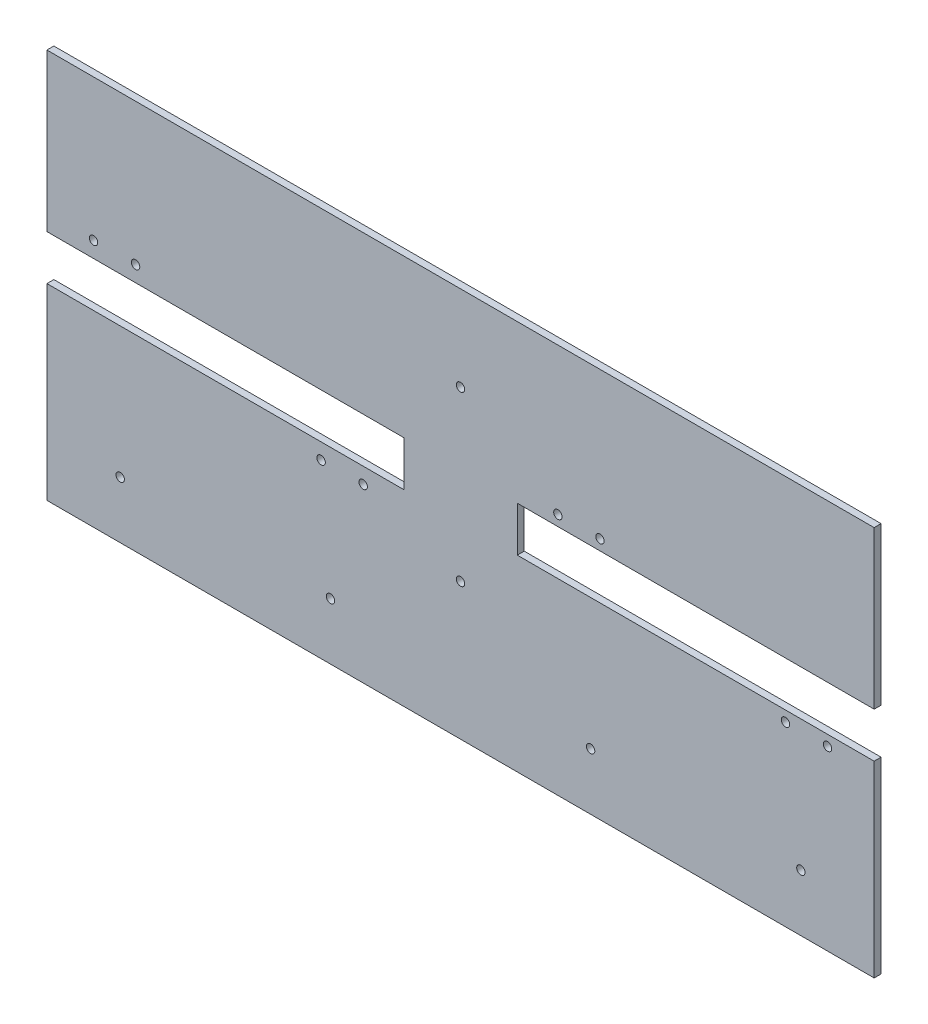
ISO-10303-21;
HEADER;
FILE_DESCRIPTION(('STEP AP214'),'2;1');
FILE_NAME('part.step','',(''),(''),'','','');
FILE_SCHEMA(('AUTOMOTIVE_DESIGN { 1 0 10303 214 1 1 1 1 }'));
ENDSEC;
DATA;
#1=APPLICATION_CONTEXT('core data for automotive mechanical design processes');
#2=APPLICATION_PROTOCOL_DEFINITION('international standard','automotive_design',2000,#1);
#3=PRODUCT_CONTEXT('',#1,'mechanical');
#4=PRODUCT('Part','Part','',(#3));
#5=PRODUCT_RELATED_PRODUCT_CATEGORY('part','',(#4));
#6=PRODUCT_DEFINITION_FORMATION('','',#4);
#7=PRODUCT_DEFINITION_CONTEXT('part definition',#1,'design');
#8=PRODUCT_DEFINITION('design','',#6,#7);
#9=PRODUCT_DEFINITION_SHAPE('','',#8);
#10=(LENGTH_UNIT() NAMED_UNIT(*) SI_UNIT(.MILLI.,.METRE.));
#11=(NAMED_UNIT(*) PLANE_ANGLE_UNIT() SI_UNIT($,.RADIAN.));
#12=(NAMED_UNIT(*) SI_UNIT($,.STERADIAN.) SOLID_ANGLE_UNIT());
#13=UNCERTAINTY_MEASURE_WITH_UNIT(LENGTH_MEASURE(1.E-05),#10,'distance_accuracy_value','');
#14=(GEOMETRIC_REPRESENTATION_CONTEXT(3) GLOBAL_UNCERTAINTY_ASSIGNED_CONTEXT((#13)) GLOBAL_UNIT_ASSIGNED_CONTEXT((#10,
#11,#12)) REPRESENTATION_CONTEXT('',''));
#15=CARTESIAN_POINT('',(0.,0.,0.));
#16=DIRECTION('',(0.,0.,1.));
#17=DIRECTION('',(1.,0.,0.));
#18=AXIS2_PLACEMENT_3D('',#15,#16,#17);
#19=CARTESIAN_POINT('',(0.,0.,0.));
#20=DIRECTION('',(0.,0.,1.));
#21=DIRECTION('',(1.,0.,0.));
#22=AXIS2_PLACEMENT_3D('',#19,#20,#21);
#23=PLANE('',#22);
#24=CARTESIAN_POINT('',(-127.525840121538,93.6999999999989,0.));
#25=DIRECTION('',(0.,0.,1.));
#26=DIRECTION('',(1.,0.,0.));
#27=AXIS2_PLACEMENT_3D('',#24,#25,#26);
#28=CIRCLE('',#27,2.);
#29=CARTESIAN_POINT('',(-125.525840121538,93.6999999999989,0.));
#30=VERTEX_POINT('',#29);
#31=EDGE_CURVE('E423',#30,#30,#28,.T.);
#32=ORIENTED_EDGE('',*,*,#31,.T.);
#33=EDGE_LOOP('',(#32));
#34=FACE_BOUND('',#33,.T.);
#35=CARTESIAN_POINT('',(201.525840121538,59.7999999999972,0.));
#36=DIRECTION('',(0.,0.,1.));
#37=DIRECTION('',(1.,0.,0.));
#38=AXIS2_PLACEMENT_3D('',#35,#36,#37);
#39=CIRCLE('',#38,2.);
#40=CARTESIAN_POINT('',(203.525840121538,59.7999999999972,0.));
#41=VERTEX_POINT('',#40);
#42=EDGE_CURVE('E449',#41,#41,#39,.T.);
#43=ORIENTED_EDGE('',*,*,#42,.T.);
#44=EDGE_LOOP('',(#43));
#45=FACE_BOUND('',#44,.T.);
#46=CARTESIAN_POINT('',(181.525840121538,59.7999999999971,0.));
#47=DIRECTION('',(0.,0.,1.));
#48=DIRECTION('',(1.,0.,0.));
#49=AXIS2_PLACEMENT_3D('',#46,#47,#48);
#50=CIRCLE('',#49,2.);
#51=CARTESIAN_POINT('',(183.525840121538,59.7999999999971,0.));
#52=VERTEX_POINT('',#51);
#53=EDGE_CURVE('E443',#52,#52,#50,.T.);
#54=ORIENTED_EDGE('',*,*,#53,.T.);
#55=EDGE_LOOP('',(#54));
#56=FACE_BOUND('',#55,.T.);
#57=CARTESIAN_POINT('',(73.3033686687433,91.1999999999977,0.));
#58=DIRECTION('',(0.,0.,1.));
#59=DIRECTION('',(1.,0.,0.));
#60=AXIS2_PLACEMENT_3D('',#57,#58,#59);
#61=CIRCLE('',#60,2.);
#62=CARTESIAN_POINT('',(75.3033686687433,91.1999999999977,0.));
#63=VERTEX_POINT('',#62);
#64=EDGE_CURVE('E436',#63,#63,#61,.T.);
#65=ORIENTED_EDGE('',*,*,#64,.T.);
#66=EDGE_LOOP('',(#65));
#67=FACE_BOUND('',#66,.T.);
#68=CARTESIAN_POINT('',(-39.3033686687433,57.2999999999976,0.));
#69=DIRECTION('',(0.,0.,1.));
#70=DIRECTION('',(1.,0.,0.));
#71=AXIS2_PLACEMENT_3D('',#68,#69,#70);
#72=CIRCLE('',#71,2.);
#73=CARTESIAN_POINT('',(-37.3033686687433,57.2999999999976,0.));
#74=VERTEX_POINT('',#73);
#75=EDGE_CURVE('E617',#74,#74,#72,.T.);
#76=ORIENTED_EDGE('',*,*,#75,.T.);
#77=EDGE_LOOP('',(#76));
#78=FACE_BOUND('',#77,.T.);
#79=CARTESIAN_POINT('',(-19.3033686687433,57.2999999999976,0.));
#80=DIRECTION('',(0.,0.,1.));
#81=DIRECTION('',(1.,0.,0.));
#82=AXIS2_PLACEMENT_3D('',#79,#80,#81);
#83=CIRCLE('',#82,2.00000000000001);
#84=CARTESIAN_POINT('',(-17.3033686687433,57.2999999999976,0.));
#85=VERTEX_POINT('',#84);
#86=EDGE_CURVE('E616',#85,#85,#83,.T.);
#87=ORIENTED_EDGE('',*,*,#86,.T.);
#88=EDGE_LOOP('',(#87));
#89=FACE_BOUND('',#88,.T.);
#90=CARTESIAN_POINT('',(-147.525840121538,93.6999999999989,0.));
#91=DIRECTION('',(0.,0.,1.));
#92=DIRECTION('',(1.,0.,0.));
#93=AXIS2_PLACEMENT_3D('',#90,#91,#92);
#94=CIRCLE('',#93,2.);
#95=CARTESIAN_POINT('',(-145.525840121538,93.6999999999989,0.));
#96=VERTEX_POINT('',#95);
#97=EDGE_CURVE('E427',#96,#96,#94,.T.);
#98=ORIENTED_EDGE('',*,*,#97,.T.);
#99=EDGE_LOOP('',(#98));
#100=FACE_BOUND('',#99,.T.);
#101=CARTESIAN_POINT('',(93.3033686687433,91.1999999999977,0.));
#102=DIRECTION('',(0.,0.,1.));
#103=DIRECTION('',(1.,0.,0.));
#104=AXIS2_PLACEMENT_3D('',#101,#102,#103);
#105=CIRCLE('',#104,2.);
#106=CARTESIAN_POINT('',(95.3033686687433,91.1999999999977,0.));
#107=VERTEX_POINT('',#106);
#108=EDGE_CURVE('E153',#107,#107,#105,.T.);
#109=ORIENTED_EDGE('',*,*,#108,.T.);
#110=EDGE_LOOP('',(#109));
#111=FACE_BOUND('',#110,.T.);
#112=CARTESIAN_POINT('',(27.,120.495952673398,0.));
#113=DIRECTION('',(0.,0.,-1.));
#114=DIRECTION('',(-1.,0.,0.));
#115=AXIS2_PLACEMENT_3D('',#112,#113,#114);
#116=CIRCLE('',#115,2.00000000976001);
#117=CARTESIAN_POINT('',(24.99999999024,120.495952673398,0.));
#118=VERTEX_POINT('',#117);
#119=EDGE_CURVE('E169',#118,#118,#116,.T.);
#120=ORIENTED_EDGE('',*,*,#119,.F.);
#121=EDGE_LOOP('',(#120));
#122=FACE_BOUND('',#121,.T.);
#123=CARTESIAN_POINT('',(27.,40.4959526733982,0.));
#124=DIRECTION('',(0.,0.,-1.));
#125=DIRECTION('',(-1.,0.,0.));
#126=AXIS2_PLACEMENT_3D('',#123,#124,#125);
#127=CIRCLE('',#126,2.00000000976001);
#128=CARTESIAN_POINT('',(24.99999999024,40.4959526733982,0.));
#129=VERTEX_POINT('',#128);
#130=EDGE_CURVE('E173',#129,#129,#127,.T.);
#131=ORIENTED_EDGE('',*,*,#130,.F.);
#132=EDGE_LOOP('',(#131));
#133=FACE_BOUND('',#132,.T.);
#134=CARTESIAN_POINT('',(-134.850000000005,2.50000000000011,0.));
#135=DIRECTION('',(0.,0.,1.));
#136=DIRECTION('',(1.,0.,0.));
#137=AXIS2_PLACEMENT_3D('',#134,#135,#136);
#138=CIRCLE('',#137,2.);
#139=CARTESIAN_POINT('',(-132.850000000005,2.50000000000011,0.));
#140=VERTEX_POINT('',#139);
#141=EDGE_CURVE('E176',#140,#140,#138,.T.);
#142=ORIENTED_EDGE('',*,*,#141,.T.);
#143=EDGE_LOOP('',(#142));
#144=FACE_BOUND('',#143,.T.);
#145=CARTESIAN_POINT('',(88.8500000000045,2.50000000000011,0.));
#146=DIRECTION('',(0.,0.,1.));
#147=DIRECTION('',(1.,0.,0.));
#148=AXIS2_PLACEMENT_3D('',#145,#146,#147);
#149=CIRCLE('',#148,2.);
#150=CARTESIAN_POINT('',(90.8500000000045,2.50000000000011,0.));
#151=VERTEX_POINT('',#150);
#152=EDGE_CURVE('E177',#151,#151,#149,.T.);
#153=ORIENTED_EDGE('',*,*,#152,.T.);
#154=EDGE_LOOP('',(#153));
#155=FACE_BOUND('',#154,.T.);
#156=CARTESIAN_POINT('',(188.850000000005,2.50000000000011,0.));
#157=DIRECTION('',(0.,0.,-1.));
#158=DIRECTION('',(-1.,0.,0.));
#159=AXIS2_PLACEMENT_3D('',#156,#157,#158);
#160=CIRCLE('',#159,2.);
#161=CARTESIAN_POINT('',(186.850000000005,2.50000000000011,0.));
#162=VERTEX_POINT('',#161);
#163=EDGE_CURVE('E180',#162,#162,#160,.T.);
#164=ORIENTED_EDGE('',*,*,#163,.F.);
#165=EDGE_LOOP('',(#164));
#166=FACE_BOUND('',#165,.T.);
#167=CARTESIAN_POINT('',(-34.8500000000045,2.50000000000011,0.));
#168=DIRECTION('',(0.,0.,-1.));
#169=DIRECTION('',(-1.,0.,0.));
#170=AXIS2_PLACEMENT_3D('',#167,#168,#169);
#171=CIRCLE('',#170,2.);
#172=CARTESIAN_POINT('',(-36.8500000000045,2.50000000000011,0.));
#173=VERTEX_POINT('',#172);
#174=EDGE_CURVE('E168',#173,#173,#171,.T.);
#175=ORIENTED_EDGE('',*,*,#174,.F.);
#176=EDGE_LOOP('',(#175));
#177=FACE_BOUND('',#176,.T.);
#178=DIRECTION('',(0.,1.,0.));
#179=VECTOR('',#178,1.);
#180=CARTESIAN_POINT('',(0.,0.,0.));
#181=LINE('',#180,#179);
#182=CARTESIAN_POINT('',(0.,64.799999999997,0.));
#183=VERTEX_POINT('',#182);
#184=CARTESIAN_POINT('',(0.,86.1999999999981,0.));
#185=VERTEX_POINT('',#184);
#186=EDGE_CURVE('E132',#183,#185,#181,.T.);
#187=ORIENTED_EDGE('',*,*,#186,.T.);
#188=DIRECTION('',(1.,0.,0.));
#189=VECTOR('',#188,1.);
#190=CARTESIAN_POINT('',(0.,86.1999999999981,0.));
#191=LINE('',#190,#189);
#192=CARTESIAN_POINT('',(-169.699999999995,86.1999999999981,0.));
#193=VERTEX_POINT('',#192);
#194=EDGE_CURVE('E129',#193,#185,#191,.T.);
#195=ORIENTED_EDGE('',*,*,#194,.F.);
#196=DIRECTION('',(0.,-1.,0.));
#197=VECTOR('',#196,1.);
#198=CARTESIAN_POINT('',(-169.699999999995,-24.5000000000014,0.));
#199=LINE('',#198,#197);
#200=CARTESIAN_POINT('',(-169.699999999995,160.991905346796,0.));
#201=VERTEX_POINT('',#200);
#202=EDGE_CURVE('E206',#201,#193,#199,.T.);
#203=ORIENTED_EDGE('',*,*,#202,.F.);
#204=DIRECTION('',(-1.,0.,0.));
#205=VECTOR('',#204,1.);
#206=CARTESIAN_POINT('',(223.700000000004,160.991905346796,0.));
#207=LINE('',#206,#205);
#208=CARTESIAN_POINT('',(223.700000000004,160.991905346796,0.));
#209=VERTEX_POINT('',#208);
#210=EDGE_CURVE('E202',#209,#201,#207,.T.);
#211=ORIENTED_EDGE('',*,*,#210,.F.);
#212=DIRECTION('',(0.,1.,0.));
#213=VECTOR('',#212,1.);
#214=CARTESIAN_POINT('',(223.700000000004,-24.5000000000014,0.));
#215=LINE('',#214,#213);
#216=CARTESIAN_POINT('',(223.700000000004,86.1999999999981,0.));
#217=VERTEX_POINT('',#216);
#218=EDGE_CURVE('E203',#217,#209,#215,.T.);
#219=ORIENTED_EDGE('',*,*,#218,.F.);
#220=DIRECTION('',(1.,0.,0.));
#221=VECTOR('',#220,1.);
#222=CARTESIAN_POINT('',(0.,86.1999999999981,0.));
#223=LINE('',#222,#221);
#224=CARTESIAN_POINT('',(54.,86.1999999999981,0.));
#225=VERTEX_POINT('',#224);
#226=EDGE_CURVE('E58',#225,#217,#223,.T.);
#227=ORIENTED_EDGE('',*,*,#226,.F.);
#228=DIRECTION('',(0.,1.,0.));
#229=VECTOR('',#228,1.);
#230=CARTESIAN_POINT('',(54.,0.,0.));
#231=LINE('',#230,#229);
#232=CARTESIAN_POINT('',(54.,64.799999999997,0.));
#233=VERTEX_POINT('',#232);
#234=EDGE_CURVE('E152',#233,#225,#231,.T.);
#235=ORIENTED_EDGE('',*,*,#234,.F.);
#236=DIRECTION('',(1.,0.,0.));
#237=VECTOR('',#236,1.);
#238=CARTESIAN_POINT('',(0.,64.799999999997,0.));
#239=LINE('',#238,#237);
#240=CARTESIAN_POINT('',(223.700000000004,64.7999999999969,0.));
#241=VERTEX_POINT('',#240);
#242=EDGE_CURVE('E149',#233,#241,#239,.T.);
#243=ORIENTED_EDGE('',*,*,#242,.T.);
#244=CARTESIAN_POINT('',(223.700000000004,-24.5000000000014,0.));
#245=VERTEX_POINT('',#244);
#246=EDGE_CURVE('E199',#245,#241,#215,.T.);
#247=ORIENTED_EDGE('',*,*,#246,.F.);
#248=DIRECTION('',(1.,0.,0.));
#249=VECTOR('',#248,1.);
#250=CARTESIAN_POINT('',(223.700000000004,-24.5000000000014,0.));
#251=LINE('',#250,#249);
#252=CARTESIAN_POINT('',(-169.699999999995,-24.5000000000014,0.));
#253=VERTEX_POINT('',#252);
#254=EDGE_CURVE('E209',#253,#245,#251,.T.);
#255=ORIENTED_EDGE('',*,*,#254,.F.);
#256=CARTESIAN_POINT('',(-169.699999999995,64.7999999999969,0.));
#257=VERTEX_POINT('',#256);
#258=EDGE_CURVE('E142',#257,#253,#199,.T.);
#259=ORIENTED_EDGE('',*,*,#258,.F.);
#260=DIRECTION('',(1.,0.,0.));
#261=VECTOR('',#260,1.);
#262=CARTESIAN_POINT('',(0.,64.799999999997,0.));
#263=LINE('',#262,#261);
#264=EDGE_CURVE('E50',#257,#183,#263,.T.);
#265=ORIENTED_EDGE('',*,*,#264,.T.);
#266=EDGE_LOOP('',(#187,#195,#203,#211,#219,#227,#235,#243,#247,#255,#259,#265));
#267=FACE_BOUND('',#266,.T.);
#268=ADVANCED_FACE('F35',(#34,#45,#56,#67,#78,#89,#100,#111,#122,#133,#144,#155,#166,#177,#267),
#23,.F.);
#269=CARTESIAN_POINT('',(-761.954178616349,-24.5000000000014,3.30000000000069));
#270=DIRECTION('',(0.,0.,-1.));
#271=DIRECTION('',(0.,-1.,0.));
#272=AXIS2_PLACEMENT_3D('',#269,#270,#271);
#273=PLANE('',#272);
#274=CARTESIAN_POINT('',(-127.525840121538,93.6999999999989,3.30000000000015));
#275=DIRECTION('',(0.,0.,1.));
#276=DIRECTION('',(1.,0.,0.));
#277=AXIS2_PLACEMENT_3D('',#274,#275,#276);
#278=CIRCLE('',#277,2.);
#279=CARTESIAN_POINT('',(-125.525840121538,93.6999999999989,3.30000000000015));
#280=VERTEX_POINT('',#279);
#281=EDGE_CURVE('E426',#280,#280,#278,.T.);
#282=ORIENTED_EDGE('',*,*,#281,.F.);
#283=EDGE_LOOP('',(#282));
#284=FACE_BOUND('',#283,.T.);
#285=CARTESIAN_POINT('',(201.525840121538,59.7999999999972,3.30000000000015));
#286=DIRECTION('',(0.,0.,1.));
#287=DIRECTION('',(1.,0.,0.));
#288=AXIS2_PLACEMENT_3D('',#285,#286,#287);
#289=CIRCLE('',#288,2.);
#290=CARTESIAN_POINT('',(203.525840121538,59.7999999999972,3.30000000000015));
#291=VERTEX_POINT('',#290);
#292=EDGE_CURVE('E429',#291,#291,#289,.T.);
#293=ORIENTED_EDGE('',*,*,#292,.F.);
#294=EDGE_LOOP('',(#293));
#295=FACE_BOUND('',#294,.T.);
#296=CARTESIAN_POINT('',(181.525840121538,59.7999999999971,3.30000000000015));
#297=DIRECTION('',(0.,0.,1.));
#298=DIRECTION('',(1.,0.,0.));
#299=AXIS2_PLACEMENT_3D('',#296,#297,#298);
#300=CIRCLE('',#299,2.);
#301=CARTESIAN_POINT('',(183.525840121538,59.7999999999971,3.30000000000015));
#302=VERTEX_POINT('',#301);
#303=EDGE_CURVE('E446',#302,#302,#300,.T.);
#304=ORIENTED_EDGE('',*,*,#303,.F.);
#305=EDGE_LOOP('',(#304));
#306=FACE_BOUND('',#305,.T.);
#307=CARTESIAN_POINT('',(73.3033686687433,91.1999999999977,3.30000000000015));
#308=DIRECTION('',(0.,0.,1.));
#309=DIRECTION('',(1.,0.,0.));
#310=AXIS2_PLACEMENT_3D('',#307,#308,#309);
#311=CIRCLE('',#310,2.);
#312=CARTESIAN_POINT('',(75.3033686687433,91.1999999999977,3.30000000000015));
#313=VERTEX_POINT('',#312);
#314=EDGE_CURVE('E440',#313,#313,#311,.T.);
#315=ORIENTED_EDGE('',*,*,#314,.F.);
#316=EDGE_LOOP('',(#315));
#317=FACE_BOUND('',#316,.T.);
#318=CARTESIAN_POINT('',(-39.3033686687433,57.2999999999976,3.30000000000015));
#319=DIRECTION('',(0.,0.,1.));
#320=DIRECTION('',(1.,0.,0.));
#321=AXIS2_PLACEMENT_3D('',#318,#319,#320);
#322=CIRCLE('',#321,2.);
#323=CARTESIAN_POINT('',(-37.3033686687433,57.2999999999976,3.30000000000015));
#324=VERTEX_POINT('',#323);
#325=EDGE_CURVE('E622',#324,#324,#322,.T.);
#326=ORIENTED_EDGE('',*,*,#325,.F.);
#327=EDGE_LOOP('',(#326));
#328=FACE_BOUND('',#327,.T.);
#329=CARTESIAN_POINT('',(-19.3033686687433,57.2999999999976,3.30000000000015));
#330=DIRECTION('',(0.,0.,1.));
#331=DIRECTION('',(1.,0.,0.));
#332=AXIS2_PLACEMENT_3D('',#329,#330,#331);
#333=CIRCLE('',#332,2.00000000000001);
#334=CARTESIAN_POINT('',(-17.3033686687433,57.2999999999976,3.30000000000015));
#335=VERTEX_POINT('',#334);
#336=EDGE_CURVE('E613',#335,#335,#333,.T.);
#337=ORIENTED_EDGE('',*,*,#336,.F.);
#338=EDGE_LOOP('',(#337));
#339=FACE_BOUND('',#338,.T.);
#340=CARTESIAN_POINT('',(-147.525840121538,93.6999999999989,3.30000000000015));
#341=DIRECTION('',(0.,0.,1.));
#342=DIRECTION('',(1.,0.,0.));
#343=AXIS2_PLACEMENT_3D('',#340,#341,#342);
#344=CIRCLE('',#343,2.);
#345=CARTESIAN_POINT('',(-145.525840121538,93.6999999999989,3.30000000000015));
#346=VERTEX_POINT('',#345);
#347=EDGE_CURVE('E432',#346,#346,#344,.T.);
#348=ORIENTED_EDGE('',*,*,#347,.F.);
#349=EDGE_LOOP('',(#348));
#350=FACE_BOUND('',#349,.T.);
#351=CARTESIAN_POINT('',(93.3033686687433,91.1999999999977,3.30000000000015));
#352=DIRECTION('',(0.,0.,1.));
#353=DIRECTION('',(1.,0.,0.));
#354=AXIS2_PLACEMENT_3D('',#351,#352,#353);
#355=CIRCLE('',#354,2.);
#356=CARTESIAN_POINT('',(95.3033686687433,91.1999999999977,3.30000000000015));
#357=VERTEX_POINT('',#356);
#358=EDGE_CURVE('E439',#357,#357,#355,.T.);
#359=ORIENTED_EDGE('',*,*,#358,.F.);
#360=EDGE_LOOP('',(#359));
#361=FACE_BOUND('',#360,.T.);
#362=CARTESIAN_POINT('',(27.,120.495952673398,3.30000000000014));
#363=DIRECTION('',(0.,0.,-1.));
#364=DIRECTION('',(-1.,0.,0.));
#365=AXIS2_PLACEMENT_3D('',#362,#363,#364);
#366=CIRCLE('',#365,2.00000000976001);
#367=CARTESIAN_POINT('',(24.99999999024,120.495952673398,3.30000000000015));
#368=VERTEX_POINT('',#367);
#369=EDGE_CURVE('E239',#368,#368,#366,.T.);
#370=ORIENTED_EDGE('',*,*,#369,.T.);
#371=EDGE_LOOP('',(#370));
#372=FACE_BOUND('',#371,.T.);
#373=CARTESIAN_POINT('',(27.,40.4959526733982,3.30000000000014));
#374=DIRECTION('',(0.,0.,-1.));
#375=DIRECTION('',(-1.,0.,0.));
#376=AXIS2_PLACEMENT_3D('',#373,#374,#375);
#377=CIRCLE('',#376,2.00000000976001);
#378=CARTESIAN_POINT('',(24.99999999024,40.4959526733982,3.30000000000014));
#379=VERTEX_POINT('',#378);
#380=EDGE_CURVE('E233',#379,#379,#377,.T.);
#381=ORIENTED_EDGE('',*,*,#380,.T.);
#382=EDGE_LOOP('',(#381));
#383=FACE_BOUND('',#382,.T.);
#384=CARTESIAN_POINT('',(-134.850000000005,2.50000000000011,3.30000000000025));
#385=DIRECTION('',(0.,0.,-1.));
#386=DIRECTION('',(-1.,0.,0.));
#387=AXIS2_PLACEMENT_3D('',#384,#385,#386);
#388=CIRCLE('',#387,2.);
#389=CARTESIAN_POINT('',(-136.850000000005,2.50000000000011,3.30000000000025));
#390=VERTEX_POINT('',#389);
#391=EDGE_CURVE('E172',#390,#390,#388,.F.);
#392=ORIENTED_EDGE('',*,*,#391,.F.);
#393=EDGE_LOOP('',(#392));
#394=FACE_BOUND('',#393,.T.);
#395=CARTESIAN_POINT('',(88.8500000000045,2.50000000000011,3.30000000000009));
#396=DIRECTION('',(0.,0.,-1.));
#397=DIRECTION('',(-1.,0.,0.));
#398=AXIS2_PLACEMENT_3D('',#395,#396,#397);
#399=CIRCLE('',#398,2.);
#400=CARTESIAN_POINT('',(86.8500000000045,2.50000000000011,3.30000000000009));
#401=VERTEX_POINT('',#400);
#402=EDGE_CURVE('E227',#401,#401,#399,.F.);
#403=ORIENTED_EDGE('',*,*,#402,.F.);
#404=EDGE_LOOP('',(#403));
#405=FACE_BOUND('',#404,.T.);
#406=CARTESIAN_POINT('',(188.850000000005,2.50000000000011,3.30000000000002));
#407=DIRECTION('',(0.,0.,-1.));
#408=DIRECTION('',(-1.,0.,0.));
#409=AXIS2_PLACEMENT_3D('',#406,#407,#408);
#410=CIRCLE('',#409,2.);
#411=CARTESIAN_POINT('',(186.850000000005,2.50000000000011,3.30000000000002));
#412=VERTEX_POINT('',#411);
#413=EDGE_CURVE('E230',#412,#412,#410,.T.);
#414=ORIENTED_EDGE('',*,*,#413,.T.);
#415=EDGE_LOOP('',(#414));
#416=FACE_BOUND('',#415,.T.);
#417=CARTESIAN_POINT('',(-34.8500000000045,2.50000000000011,3.30000000000018));
#418=DIRECTION('',(0.,0.,-1.));
#419=DIRECTION('',(-1.,0.,0.));
#420=AXIS2_PLACEMENT_3D('',#417,#418,#419);
#421=CIRCLE('',#420,2.);
#422=CARTESIAN_POINT('',(-36.8500000000045,2.50000000000011,3.30000000000018));
#423=VERTEX_POINT('',#422);
#424=EDGE_CURVE('E236',#423,#423,#421,.T.);
#425=ORIENTED_EDGE('',*,*,#424,.T.);
#426=EDGE_LOOP('',(#425));
#427=FACE_BOUND('',#426,.T.);
#428=DIRECTION('',(0.,1.,0.));
#429=VECTOR('',#428,1.);
#430=CARTESIAN_POINT('',(-169.699999999995,-24.5000000000014,3.30000000000025));
#431=LINE('',#430,#429);
#432=CARTESIAN_POINT('',(-169.699999999995,86.1999999999981,3.30000000000025));
#433=VERTEX_POINT('',#432);
#434=CARTESIAN_POINT('',(-169.699999999995,160.991905346796,3.30000000000027));
#435=VERTEX_POINT('',#434);
#436=EDGE_CURVE('E191',#433,#435,#431,.T.);
#437=ORIENTED_EDGE('',*,*,#436,.F.);
#438=DIRECTION('',(1.,0.,0.));
#439=VECTOR('',#438,1.);
#440=CARTESIAN_POINT('',(-761.954178616349,86.1999999999982,3.3000000000007));
#441=LINE('',#440,#439);
#442=CARTESIAN_POINT('',(0.,86.1999999999981,3.30000000000022));
#443=VERTEX_POINT('',#442);
#444=EDGE_CURVE('E165',#433,#443,#441,.T.);
#445=ORIENTED_EDGE('',*,*,#444,.T.);
#446=DIRECTION('',(0.,1.,0.));
#447=VECTOR('',#446,1.);
#448=CARTESIAN_POINT('',(0.,-24.5000000000014,3.30000000000015));
#449=LINE('',#448,#447);
#450=CARTESIAN_POINT('',(0.,64.799999999997,3.30000000000022));
#451=VERTEX_POINT('',#450);
#452=EDGE_CURVE('E11',#451,#443,#449,.T.);
#453=ORIENTED_EDGE('',*,*,#452,.F.);
#454=DIRECTION('',(1.,0.,0.));
#455=VECTOR('',#454,1.);
#456=CARTESIAN_POINT('',(-761.954178616349,64.799999999997,3.3000000000007));
#457=LINE('',#456,#455);
#458=CARTESIAN_POINT('',(-169.699999999995,64.7999999999969,3.30000000000025));
#459=VERTEX_POINT('',#458);
#460=EDGE_CURVE('E125',#459,#451,#457,.T.);
#461=ORIENTED_EDGE('',*,*,#460,.F.);
#462=CARTESIAN_POINT('',(-169.699999999995,-24.5000000000014,3.30000000000014));
#463=VERTEX_POINT('',#462);
#464=EDGE_CURVE('E187',#463,#459,#431,.T.);
#465=ORIENTED_EDGE('',*,*,#464,.F.);
#466=DIRECTION('',(-1.,0.,0.));
#467=VECTOR('',#466,1.);
#468=CARTESIAN_POINT('',(223.700000000004,-24.5000000000014,3.29999999999997));
#469=LINE('',#468,#467);
#470=CARTESIAN_POINT('',(223.700000000004,-24.5000000000014,3.29999999999997));
#471=VERTEX_POINT('',#470);
#472=EDGE_CURVE('E222',#471,#463,#469,.T.);
#473=ORIENTED_EDGE('',*,*,#472,.F.);
#474=DIRECTION('',(0.,-1.,0.));
#475=VECTOR('',#474,1.);
#476=CARTESIAN_POINT('',(223.700000000004,-24.5000000000013,3.29999999999997));
#477=LINE('',#476,#475);
#478=CARTESIAN_POINT('',(223.700000000004,64.7999999999969,3.30000000000019));
#479=VERTEX_POINT('',#478);
#480=EDGE_CURVE('E194',#479,#471,#477,.T.);
#481=ORIENTED_EDGE('',*,*,#480,.F.);
#482=DIRECTION('',(1.,0.,0.));
#483=VECTOR('',#482,1.);
#484=CARTESIAN_POINT('',(-761.954178616349,64.799999999997,3.3000000000007));
#485=LINE('',#484,#483);
#486=CARTESIAN_POINT('',(54.,64.799999999997,3.30000000000012));
#487=VERTEX_POINT('',#486);
#488=EDGE_CURVE('E162',#487,#479,#485,.T.);
#489=ORIENTED_EDGE('',*,*,#488,.F.);
#490=DIRECTION('',(0.,1.,0.));
#491=VECTOR('',#490,1.);
#492=CARTESIAN_POINT('',(54.,-24.5000000000014,3.30000000000011));
#493=LINE('',#492,#491);
#494=CARTESIAN_POINT('',(54.,86.1999999999981,3.30000000000012));
#495=VERTEX_POINT('',#494);
#496=EDGE_CURVE('E43',#487,#495,#493,.T.);
#497=ORIENTED_EDGE('',*,*,#496,.T.);
#498=DIRECTION('',(1.,0.,0.));
#499=VECTOR('',#498,1.);
#500=CARTESIAN_POINT('',(-761.954178616349,86.1999999999982,3.3000000000007));
#501=LINE('',#500,#499);
#502=CARTESIAN_POINT('',(223.700000000004,86.1999999999981,3.30000000000019));
#503=VERTEX_POINT('',#502);
#504=EDGE_CURVE('E147',#495,#503,#501,.T.);
#505=ORIENTED_EDGE('',*,*,#504,.T.);
#506=CARTESIAN_POINT('',(223.700000000004,160.991905346796,3.30000000000003));
#507=VERTEX_POINT('',#506);
#508=EDGE_CURVE('E195',#507,#503,#477,.T.);
#509=ORIENTED_EDGE('',*,*,#508,.F.);
#510=DIRECTION('',(1.,0.,0.));
#511=VECTOR('',#510,1.);
#512=CARTESIAN_POINT('',(223.700000000004,160.991905346796,3.30000000000003));
#513=LINE('',#512,#511);
#514=EDGE_CURVE('E190',#435,#507,#513,.T.);
#515=ORIENTED_EDGE('',*,*,#514,.F.);
#516=EDGE_LOOP('',(#437,#445,#453,#461,#465,#473,#481,#489,#497,#505,#509,#515));
#517=FACE_BOUND('',#516,.T.);
#518=ADVANCED_FACE('F253',(#284,#295,#306,#317,#328,#339,#350,#361,#372,#383,#394,#405,#416,
#427,#517),#273,.F.);
#519=CARTESIAN_POINT('',(-169.699999999995,-24.5000000000014,438.237704676412));
#520=DIRECTION('',(1.,0.,0.));
#521=DIRECTION('',(0.,0.,-1.));
#522=AXIS2_PLACEMENT_3D('',#519,#520,#521);
#523=PLANE('',#522);
#524=DIRECTION('',(0.,0.,1.));
#525=VECTOR('',#524,1.);
#526=CARTESIAN_POINT('',(-169.699999999995,64.799999999997,438.237704676412));
#527=LINE('',#526,#525);
#528=EDGE_CURVE('E245',#257,#459,#527,.T.);
#529=ORIENTED_EDGE('',*,*,#528,.F.);
#530=ORIENTED_EDGE('',*,*,#258,.T.);
#531=DIRECTION('',(0.,0.,-1.));
#532=VECTOR('',#531,1.);
#533=CARTESIAN_POINT('',(-169.699999999995,-24.5000000000014,438.237704676412));
#534=LINE('',#533,#532);
#535=EDGE_CURVE('E214',#463,#253,#534,.T.);
#536=ORIENTED_EDGE('',*,*,#535,.F.);
#537=ORIENTED_EDGE('',*,*,#464,.T.);
#538=EDGE_LOOP('',(#529,#530,#536,#537));
#539=FACE_BOUND('',#538,.T.);
#540=ADVANCED_FACE('F295',(#539),#523,.F.);
#541=CARTESIAN_POINT('',(223.700000000004,-24.5000000000014,438.237704676412));
#542=DIRECTION('',(-1.,0.,0.));
#543=DIRECTION('',(0.,0.,1.));
#544=AXIS2_PLACEMENT_3D('',#541,#542,#543);
#545=PLANE('',#544);
#546=DIRECTION('',(0.,0.,-1.));
#547=VECTOR('',#546,1.);
#548=CARTESIAN_POINT('',(223.700000000004,64.7999999999969,438.237704676412));
#549=LINE('',#548,#547);
#550=EDGE_CURVE('E243',#479,#241,#549,.T.);
#551=ORIENTED_EDGE('',*,*,#550,.F.);
#552=ORIENTED_EDGE('',*,*,#480,.T.);
#553=DIRECTION('',(0.,0.,-1.));
#554=VECTOR('',#553,1.);
#555=CARTESIAN_POINT('',(223.700000000004,-24.5000000000014,438.237704676412));
#556=LINE('',#555,#554);
#557=EDGE_CURVE('E212',#471,#245,#556,.T.);
#558=ORIENTED_EDGE('',*,*,#557,.T.);
#559=ORIENTED_EDGE('',*,*,#246,.T.);
#560=EDGE_LOOP('',(#551,#552,#558,#559));
#561=FACE_BOUND('',#560,.T.);
#562=ADVANCED_FACE('F305',(#561),#545,.F.);
#563=CARTESIAN_POINT('',(223.700000000004,-24.5000000000014,438.237704676412));
#564=DIRECTION('',(0.,1.,0.));
#565=DIRECTION('',(-1.,0.,0.));
#566=AXIS2_PLACEMENT_3D('',#563,#564,#565);
#567=PLANE('',#566);
#568=ORIENTED_EDGE('',*,*,#557,.F.);
#569=ORIENTED_EDGE('',*,*,#472,.T.);
#570=ORIENTED_EDGE('',*,*,#535,.T.);
#571=ORIENTED_EDGE('',*,*,#254,.T.);
#572=EDGE_LOOP('',(#568,#569,#570,#571));
#573=FACE_BOUND('',#572,.T.);
#574=ADVANCED_FACE('F302',(#573),#567,.F.);
#575=ORIENTED_EDGE('',*,*,#202,.T.);
#576=DIRECTION('',(0.,0.,1.));
#577=VECTOR('',#576,1.);
#578=CARTESIAN_POINT('',(-169.699999999995,86.1999999999981,438.237704676412));
#579=LINE('',#578,#577);
#580=EDGE_CURVE('E247',#193,#433,#579,.T.);
#581=ORIENTED_EDGE('',*,*,#580,.T.);
#582=ORIENTED_EDGE('',*,*,#436,.T.);
#583=DIRECTION('',(0.,0.,-1.));
#584=VECTOR('',#583,1.);
#585=CARTESIAN_POINT('',(-169.699999999995,160.991905346796,438.237704676412));
#586=LINE('',#585,#584);
#587=EDGE_CURVE('E217',#435,#201,#586,.T.);
#588=ORIENTED_EDGE('',*,*,#587,.T.);
#589=EDGE_LOOP('',(#575,#581,#582,#588));
#590=FACE_BOUND('',#589,.T.);
#591=ADVANCED_FACE('F275',(#590),#523,.F.);
#592=CARTESIAN_POINT('',(223.700000000004,160.991905346796,438.237704676412));
#593=DIRECTION('',(0.,-1.,0.));
#594=DIRECTION('',(1.,0.,0.));
#595=AXIS2_PLACEMENT_3D('',#592,#593,#594);
#596=PLANE('',#595);
#597=ORIENTED_EDGE('',*,*,#587,.F.);
#598=ORIENTED_EDGE('',*,*,#514,.T.);
#599=DIRECTION('',(0.,0.,-1.));
#600=VECTOR('',#599,1.);
#601=CARTESIAN_POINT('',(223.700000000004,160.991905346796,438.237704676412));
#602=LINE('',#601,#600);
#603=EDGE_CURVE('E219',#507,#209,#602,.T.);
#604=ORIENTED_EDGE('',*,*,#603,.T.);
#605=ORIENTED_EDGE('',*,*,#210,.T.);
#606=EDGE_LOOP('',(#597,#598,#604,#605));
#607=FACE_BOUND('',#606,.T.);
#608=ADVANCED_FACE('F272',(#607),#596,.F.);
#609=ORIENTED_EDGE('',*,*,#508,.T.);
#610=DIRECTION('',(0.,0.,-1.));
#611=VECTOR('',#610,1.);
#612=CARTESIAN_POINT('',(223.700000000004,86.1999999999981,438.237704676412));
#613=LINE('',#612,#611);
#614=EDGE_CURVE('E198',#503,#217,#613,.T.);
#615=ORIENTED_EDGE('',*,*,#614,.T.);
#616=ORIENTED_EDGE('',*,*,#218,.T.);
#617=ORIENTED_EDGE('',*,*,#603,.F.);
#618=EDGE_LOOP('',(#609,#615,#616,#617));
#619=FACE_BOUND('',#618,.T.);
#620=ADVANCED_FACE('F37',(#619),#545,.F.);
#621=CARTESIAN_POINT('',(-134.850000000005,2.50000000000011,4.));
#622=DIRECTION('',(0.,0.,-1.));
#623=DIRECTION('',(-1.,0.,0.));
#624=AXIS2_PLACEMENT_3D('',#621,#622,#623);
#625=CYLINDRICAL_SURFACE('',#624,2.);
#626=ORIENTED_EDGE('',*,*,#141,.F.);
#627=EDGE_LOOP('',(#626));
#628=FACE_BOUND('',#627,.T.);
#629=ORIENTED_EDGE('',*,*,#391,.T.);
#630=EDGE_LOOP('',(#629));
#631=FACE_BOUND('',#630,.T.);
#632=ADVANCED_FACE('F312',(#628,#631),#625,.F.);
#633=CARTESIAN_POINT('',(88.8500000000045,2.50000000000011,4.));
#634=DIRECTION('',(0.,0.,-1.));
#635=DIRECTION('',(-1.,0.,0.));
#636=AXIS2_PLACEMENT_3D('',#633,#634,#635);
#637=CYLINDRICAL_SURFACE('',#636,2.);
#638=ORIENTED_EDGE('',*,*,#152,.F.);
#639=EDGE_LOOP('',(#638));
#640=FACE_BOUND('',#639,.T.);
#641=ORIENTED_EDGE('',*,*,#402,.T.);
#642=EDGE_LOOP('',(#641));
#643=FACE_BOUND('',#642,.T.);
#644=ADVANCED_FACE('F316',(#640,#643),#637,.F.);
#645=CARTESIAN_POINT('',(188.850000000005,2.50000000000011,4.));
#646=DIRECTION('',(0.,0.,-1.));
#647=DIRECTION('',(-1.,0.,0.));
#648=AXIS2_PLACEMENT_3D('',#645,#646,#647);
#649=CYLINDRICAL_SURFACE('',#648,2.);
#650=ORIENTED_EDGE('',*,*,#163,.T.);
#651=EDGE_LOOP('',(#650));
#652=FACE_BOUND('',#651,.T.);
#653=ORIENTED_EDGE('',*,*,#413,.F.);
#654=EDGE_LOOP('',(#653));
#655=FACE_BOUND('',#654,.T.);
#656=ADVANCED_FACE('F480',(#652,#655),#649,.F.);
#657=CARTESIAN_POINT('',(27.,40.4959526733982,4.));
#658=DIRECTION('',(0.,0.,-1.));
#659=DIRECTION('',(-1.,0.,0.));
#660=AXIS2_PLACEMENT_3D('',#657,#658,#659);
#661=CYLINDRICAL_SURFACE('',#660,2.00000000976001);
#662=ORIENTED_EDGE('',*,*,#130,.T.);
#663=EDGE_LOOP('',(#662));
#664=FACE_BOUND('',#663,.T.);
#665=ORIENTED_EDGE('',*,*,#380,.F.);
#666=EDGE_LOOP('',(#665));
#667=FACE_BOUND('',#666,.T.);
#668=ADVANCED_FACE('F471',(#664,#667),#661,.F.);
#669=CARTESIAN_POINT('',(-34.8500000000045,2.50000000000011,4.));
#670=DIRECTION('',(0.,0.,-1.));
#671=DIRECTION('',(-1.,0.,0.));
#672=AXIS2_PLACEMENT_3D('',#669,#670,#671);
#673=CYLINDRICAL_SURFACE('',#672,2.);
#674=ORIENTED_EDGE('',*,*,#174,.T.);
#675=EDGE_LOOP('',(#674));
#676=FACE_BOUND('',#675,.T.);
#677=ORIENTED_EDGE('',*,*,#424,.F.);
#678=EDGE_LOOP('',(#677));
#679=FACE_BOUND('',#678,.T.);
#680=ADVANCED_FACE('F468',(#676,#679),#673,.F.);
#681=CARTESIAN_POINT('',(27.,120.495952673398,4.));
#682=DIRECTION('',(0.,0.,-1.));
#683=DIRECTION('',(-1.,0.,0.));
#684=AXIS2_PLACEMENT_3D('',#681,#682,#683);
#685=CYLINDRICAL_SURFACE('',#684,2.00000000976001);
#686=ORIENTED_EDGE('',*,*,#119,.T.);
#687=EDGE_LOOP('',(#686));
#688=FACE_BOUND('',#687,.T.);
#689=ORIENTED_EDGE('',*,*,#369,.F.);
#690=EDGE_LOOP('',(#689));
#691=FACE_BOUND('',#690,.T.);
#692=ADVANCED_FACE('F470',(#688,#691),#685,.F.);
#693=CARTESIAN_POINT('',(54.,0.,6.));
#694=DIRECTION('',(-1.,0.,0.));
#695=DIRECTION('',(0.,0.,1.));
#696=AXIS2_PLACEMENT_3D('',#693,#694,#695);
#697=PLANE('',#696);
#698=DIRECTION('',(0.,0.,-1.));
#699=VECTOR('',#698,1.);
#700=CARTESIAN_POINT('',(54.,64.799999999997,6.));
#701=LINE('',#700,#699);
#702=EDGE_CURVE('E157',#487,#233,#701,.T.);
#703=ORIENTED_EDGE('',*,*,#702,.T.);
#704=ORIENTED_EDGE('',*,*,#234,.T.);
#705=DIRECTION('',(0.,0.,-1.));
#706=VECTOR('',#705,1.);
#707=CARTESIAN_POINT('',(54.,86.1999999999981,6.));
#708=LINE('',#707,#706);
#709=EDGE_CURVE('E138',#495,#225,#708,.T.);
#710=ORIENTED_EDGE('',*,*,#709,.F.);
#711=ORIENTED_EDGE('',*,*,#496,.F.);
#712=EDGE_LOOP('',(#703,#704,#710,#711));
#713=FACE_BOUND('',#712,.T.);
#714=ADVANCED_FACE('F258',(#713),#697,.F.);
#715=CARTESIAN_POINT('',(0.,64.799999999997,6.));
#716=DIRECTION('',(0.,1.,0.));
#717=DIRECTION('',(-1.,0.,0.));
#718=AXIS2_PLACEMENT_3D('',#715,#716,#717);
#719=PLANE('',#718);
#720=ORIENTED_EDGE('',*,*,#488,.T.);
#721=ORIENTED_EDGE('',*,*,#550,.T.);
#722=ORIENTED_EDGE('',*,*,#242,.F.);
#723=ORIENTED_EDGE('',*,*,#702,.F.);
#724=EDGE_LOOP('',(#720,#721,#722,#723));
#725=FACE_BOUND('',#724,.T.);
#726=ADVANCED_FACE('F261',(#725),#719,.T.);
#727=CARTESIAN_POINT('',(0.,86.1999999999981,6.));
#728=DIRECTION('',(0.,1.,0.));
#729=DIRECTION('',(-1.,0.,0.));
#730=AXIS2_PLACEMENT_3D('',#727,#728,#729);
#731=PLANE('',#730);
#732=ORIENTED_EDGE('',*,*,#709,.T.);
#733=ORIENTED_EDGE('',*,*,#226,.T.);
#734=ORIENTED_EDGE('',*,*,#614,.F.);
#735=ORIENTED_EDGE('',*,*,#504,.F.);
#736=EDGE_LOOP('',(#732,#733,#734,#735));
#737=FACE_BOUND('',#736,.T.);
#738=ADVANCED_FACE('F286',(#737),#731,.F.);
#739=CARTESIAN_POINT('',(0.,0.,6.));
#740=DIRECTION('',(-1.,0.,0.));
#741=DIRECTION('',(0.,0.,1.));
#742=AXIS2_PLACEMENT_3D('',#739,#740,#741);
#743=PLANE('',#742);
#744=ORIENTED_EDGE('',*,*,#452,.T.);
#745=DIRECTION('',(0.,0.,-1.));
#746=VECTOR('',#745,1.);
#747=CARTESIAN_POINT('',(0.,86.1999999999981,6.));
#748=LINE('',#747,#746);
#749=EDGE_CURVE('E128',#443,#185,#748,.T.);
#750=ORIENTED_EDGE('',*,*,#749,.T.);
#751=ORIENTED_EDGE('',*,*,#186,.F.);
#752=DIRECTION('',(0.,0.,-1.));
#753=VECTOR('',#752,1.);
#754=CARTESIAN_POINT('',(0.,64.799999999997,6.));
#755=LINE('',#754,#753);
#756=EDGE_CURVE('E121',#451,#183,#755,.T.);
#757=ORIENTED_EDGE('',*,*,#756,.F.);
#758=EDGE_LOOP('',(#744,#750,#751,#757));
#759=FACE_BOUND('',#758,.T.);
#760=ADVANCED_FACE('F133',(#759),#743,.T.);
#761=CARTESIAN_POINT('',(0.,86.1999999999981,6.));
#762=DIRECTION('',(0.,1.,0.));
#763=DIRECTION('',(-1.,0.,0.));
#764=AXIS2_PLACEMENT_3D('',#761,#762,#763);
#765=PLANE('',#764);
#766=ORIENTED_EDGE('',*,*,#580,.F.);
#767=ORIENTED_EDGE('',*,*,#194,.T.);
#768=ORIENTED_EDGE('',*,*,#749,.F.);
#769=ORIENTED_EDGE('',*,*,#444,.F.);
#770=EDGE_LOOP('',(#766,#767,#768,#769));
#771=FACE_BOUND('',#770,.T.);
#772=ADVANCED_FACE('F277',(#771),#765,.F.);
#773=CARTESIAN_POINT('',(0.,64.799999999997,6.));
#774=DIRECTION('',(0.,1.,0.));
#775=DIRECTION('',(-1.,0.,0.));
#776=AXIS2_PLACEMENT_3D('',#773,#774,#775);
#777=PLANE('',#776);
#778=ORIENTED_EDGE('',*,*,#460,.T.);
#779=ORIENTED_EDGE('',*,*,#756,.T.);
#780=ORIENTED_EDGE('',*,*,#264,.F.);
#781=ORIENTED_EDGE('',*,*,#528,.T.);
#782=EDGE_LOOP('',(#778,#779,#780,#781));
#783=FACE_BOUND('',#782,.T.);
#784=ADVANCED_FACE('F123',(#783),#777,.T.);
#785=CARTESIAN_POINT('',(93.3033686687433,91.1999999999977,0.));
#786=DIRECTION('',(0.,0.,1.));
#787=DIRECTION('',(1.,0.,0.));
#788=AXIS2_PLACEMENT_3D('',#785,#786,#787);
#789=CYLINDRICAL_SURFACE('',#788,2.);
#790=ORIENTED_EDGE('',*,*,#108,.F.);
#791=EDGE_LOOP('',(#790));
#792=FACE_BOUND('',#791,.T.);
#793=ORIENTED_EDGE('',*,*,#358,.T.);
#794=EDGE_LOOP('',(#793));
#795=FACE_BOUND('',#794,.T.);
#796=ADVANCED_FACE('F284',(#792,#795),#789,.F.);
#797=CARTESIAN_POINT('',(-147.525840121538,93.6999999999989,0.));
#798=DIRECTION('',(0.,0.,1.));
#799=DIRECTION('',(1.,0.,0.));
#800=AXIS2_PLACEMENT_3D('',#797,#798,#799);
#801=CYLINDRICAL_SURFACE('',#800,2.);
#802=ORIENTED_EDGE('',*,*,#97,.F.);
#803=EDGE_LOOP('',(#802));
#804=FACE_BOUND('',#803,.T.);
#805=ORIENTED_EDGE('',*,*,#347,.T.);
#806=EDGE_LOOP('',(#805));
#807=FACE_BOUND('',#806,.T.);
#808=ADVANCED_FACE('F347',(#804,#807),#801,.F.);
#809=CARTESIAN_POINT('',(-19.3033686687433,57.2999999999976,0.));
#810=DIRECTION('',(0.,0.,1.));
#811=DIRECTION('',(1.,0.,0.));
#812=AXIS2_PLACEMENT_3D('',#809,#810,#811);
#813=CYLINDRICAL_SURFACE('',#812,2.00000000000001);
#814=ORIENTED_EDGE('',*,*,#86,.F.);
#815=EDGE_LOOP('',(#814));
#816=FACE_BOUND('',#815,.T.);
#817=ORIENTED_EDGE('',*,*,#336,.T.);
#818=EDGE_LOOP('',(#817));
#819=FACE_BOUND('',#818,.T.);
#820=ADVANCED_FACE('F357',(#816,#819),#813,.F.);
#821=CARTESIAN_POINT('',(-39.3033686687433,57.2999999999976,0.));
#822=DIRECTION('',(0.,0.,1.));
#823=DIRECTION('',(1.,0.,0.));
#824=AXIS2_PLACEMENT_3D('',#821,#822,#823);
#825=CYLINDRICAL_SURFACE('',#824,2.);
#826=ORIENTED_EDGE('',*,*,#75,.F.);
#827=EDGE_LOOP('',(#826));
#828=FACE_BOUND('',#827,.T.);
#829=ORIENTED_EDGE('',*,*,#325,.T.);
#830=EDGE_LOOP('',(#829));
#831=FACE_BOUND('',#830,.T.);
#832=ADVANCED_FACE('F367',(#828,#831),#825,.F.);
#833=CARTESIAN_POINT('',(73.3033686687433,91.1999999999977,0.));
#834=DIRECTION('',(0.,0.,1.));
#835=DIRECTION('',(1.,0.,0.));
#836=AXIS2_PLACEMENT_3D('',#833,#834,#835);
#837=CYLINDRICAL_SURFACE('',#836,2.);
#838=ORIENTED_EDGE('',*,*,#64,.F.);
#839=EDGE_LOOP('',(#838));
#840=FACE_BOUND('',#839,.T.);
#841=ORIENTED_EDGE('',*,*,#314,.T.);
#842=EDGE_LOOP('',(#841));
#843=FACE_BOUND('',#842,.T.);
#844=ADVANCED_FACE('F377',(#840,#843),#837,.F.);
#845=CARTESIAN_POINT('',(181.525840121538,59.7999999999971,0.));
#846=DIRECTION('',(0.,0.,1.));
#847=DIRECTION('',(1.,0.,0.));
#848=AXIS2_PLACEMENT_3D('',#845,#846,#847);
#849=CYLINDRICAL_SURFACE('',#848,2.);
#850=ORIENTED_EDGE('',*,*,#53,.F.);
#851=EDGE_LOOP('',(#850));
#852=FACE_BOUND('',#851,.T.);
#853=ORIENTED_EDGE('',*,*,#303,.T.);
#854=EDGE_LOOP('',(#853));
#855=FACE_BOUND('',#854,.T.);
#856=ADVANCED_FACE('F387',(#852,#855),#849,.F.);
#857=CARTESIAN_POINT('',(201.525840121538,59.7999999999972,0.));
#858=DIRECTION('',(0.,0.,1.));
#859=DIRECTION('',(1.,0.,0.));
#860=AXIS2_PLACEMENT_3D('',#857,#858,#859);
#861=CYLINDRICAL_SURFACE('',#860,2.);
#862=ORIENTED_EDGE('',*,*,#42,.F.);
#863=EDGE_LOOP('',(#862));
#864=FACE_BOUND('',#863,.T.);
#865=ORIENTED_EDGE('',*,*,#292,.T.);
#866=EDGE_LOOP('',(#865));
#867=FACE_BOUND('',#866,.T.);
#868=ADVANCED_FACE('F397',(#864,#867),#861,.F.);
#869=CARTESIAN_POINT('',(-127.525840121538,93.6999999999989,0.));
#870=DIRECTION('',(0.,0.,1.));
#871=DIRECTION('',(1.,0.,0.));
#872=AXIS2_PLACEMENT_3D('',#869,#870,#871);
#873=CYLINDRICAL_SURFACE('',#872,2.);
#874=ORIENTED_EDGE('',*,*,#31,.F.);
#875=EDGE_LOOP('',(#874));
#876=FACE_BOUND('',#875,.T.);
#877=ORIENTED_EDGE('',*,*,#281,.T.);
#878=EDGE_LOOP('',(#877));
#879=FACE_BOUND('',#878,.T.);
#880=ADVANCED_FACE('F407',(#876,#879),#873,.F.);
#881=CLOSED_SHELL('',(#268,#518,#540,#562,#574,#591,#608,#620,#632,#644,#656,#668,#680,#692,
#714,#726,#738,#760,#772,#784,#796,#808,#820,#832,#844,#856,#868,#880));
#882=MANIFOLD_SOLID_BREP('B2',#881);
#883=ADVANCED_BREP_SHAPE_REPRESENTATION('',(#18,#882),#14);
#884=SHAPE_DEFINITION_REPRESENTATION(#9,#883);
ENDSEC;
END-ISO-10303-21;
